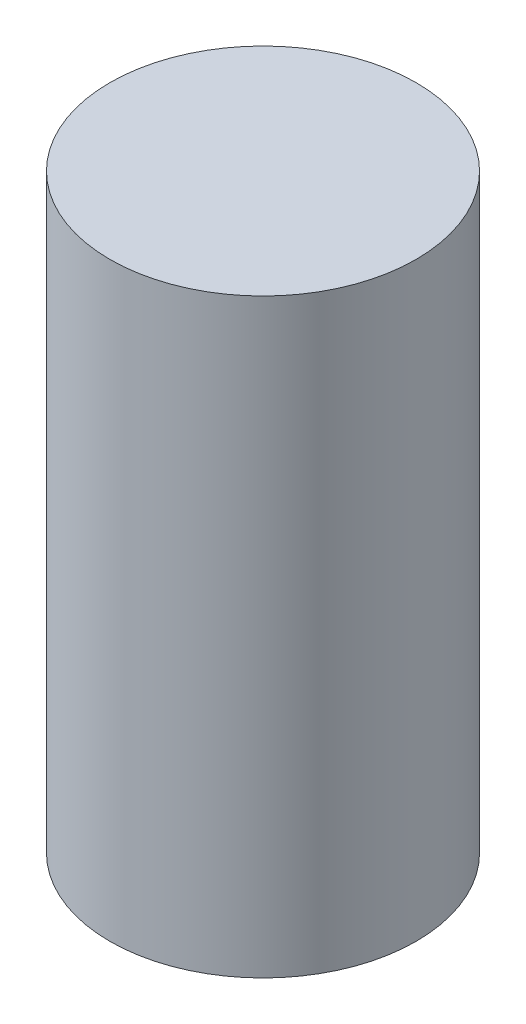
ISO-10303-21;
HEADER;
FILE_DESCRIPTION(('STEP AP214'),'2;1');
FILE_NAME('part.step','',(''),(''),'','','');
FILE_SCHEMA(('AUTOMOTIVE_DESIGN { 1 0 10303 214 1 1 1 1 }'));
ENDSEC;
DATA;
#1=APPLICATION_CONTEXT('core data for automotive mechanical design processes');
#2=APPLICATION_PROTOCOL_DEFINITION('international standard','automotive_design',2000,#1);
#3=PRODUCT_CONTEXT('',#1,'mechanical');
#4=PRODUCT('Part','Part','',(#3));
#5=PRODUCT_RELATED_PRODUCT_CATEGORY('part','',(#4));
#6=PRODUCT_DEFINITION_FORMATION('','',#4);
#7=PRODUCT_DEFINITION_CONTEXT('part definition',#1,'design');
#8=PRODUCT_DEFINITION('design','',#6,#7);
#9=PRODUCT_DEFINITION_SHAPE('','',#8);
#10=(LENGTH_UNIT() NAMED_UNIT(*) SI_UNIT(.MILLI.,.METRE.));
#11=(NAMED_UNIT(*) PLANE_ANGLE_UNIT() SI_UNIT($,.RADIAN.));
#12=(NAMED_UNIT(*) SI_UNIT($,.STERADIAN.) SOLID_ANGLE_UNIT());
#13=UNCERTAINTY_MEASURE_WITH_UNIT(LENGTH_MEASURE(1.E-05),#10,'distance_accuracy_value','');
#14=(GEOMETRIC_REPRESENTATION_CONTEXT(3) GLOBAL_UNCERTAINTY_ASSIGNED_CONTEXT((#13)) GLOBAL_UNIT_ASSIGNED_CONTEXT((#10,
#11,#12)) REPRESENTATION_CONTEXT('',''));
#15=CARTESIAN_POINT('',(0.,0.,0.));
#16=DIRECTION('',(0.,0.,1.));
#17=DIRECTION('',(1.,0.,0.));
#18=AXIS2_PLACEMENT_3D('',#15,#16,#17);
#19=CARTESIAN_POINT('',(0.,13.5,0.));
#20=DIRECTION('',(0.,-1.,0.));
#21=DIRECTION('',(0.,0.,-1.));
#22=AXIS2_PLACEMENT_3D('',#19,#20,#21);
#23=CYLINDRICAL_SURFACE('',#22,3.5);
#24=CARTESIAN_POINT('',(0.,13.5,0.));
#25=DIRECTION('',(0.,1.,0.));
#26=DIRECTION('',(0.,0.,1.));
#27=AXIS2_PLACEMENT_3D('',#24,#25,#26);
#28=CIRCLE('',#27,3.5);
#29=CARTESIAN_POINT('',(0.,13.5,3.5));
#30=VERTEX_POINT('',#29);
#31=EDGE_CURVE('E10',#30,#30,#28,.T.);
#32=ORIENTED_EDGE('',*,*,#31,.F.);
#33=EDGE_LOOP('',(#32));
#34=FACE_BOUND('',#33,.T.);
#35=CARTESIAN_POINT('',(0.,0.,0.));
#36=DIRECTION('',(0.,1.,0.));
#37=DIRECTION('',(0.,0.,1.));
#38=AXIS2_PLACEMENT_3D('',#35,#36,#37);
#39=CIRCLE('',#38,3.5);
#40=CARTESIAN_POINT('',(0.,0.,3.5));
#41=VERTEX_POINT('',#40);
#42=EDGE_CURVE('E46',#41,#41,#39,.T.);
#43=ORIENTED_EDGE('',*,*,#42,.T.);
#44=EDGE_LOOP('',(#43));
#45=FACE_BOUND('',#44,.T.);
#46=ADVANCED_FACE('F43',(#34,#45),#23,.T.);
#47=CARTESIAN_POINT('',(0.,13.5,0.));
#48=DIRECTION('',(0.,1.,0.));
#49=DIRECTION('',(0.,0.,1.));
#50=AXIS2_PLACEMENT_3D('',#47,#48,#49);
#51=PLANE('',#50);
#52=ORIENTED_EDGE('',*,*,#31,.T.);
#53=EDGE_LOOP('',(#52));
#54=FACE_BOUND('',#53,.T.);
#55=ADVANCED_FACE('F60',(#54),#51,.T.);
#56=CARTESIAN_POINT('',(0.,0.,0.));
#57=DIRECTION('',(0.,1.,0.));
#58=DIRECTION('',(0.,0.,1.));
#59=AXIS2_PLACEMENT_3D('',#56,#57,#58);
#60=PLANE('',#59);
#61=ORIENTED_EDGE('',*,*,#42,.F.);
#62=EDGE_LOOP('',(#61));
#63=FACE_BOUND('',#62,.T.);
#64=ADVANCED_FACE('F58',(#63),#60,.F.);
#65=CLOSED_SHELL('',(#46,#55,#64));
#66=MANIFOLD_SOLID_BREP('B2',#65);
#67=ADVANCED_BREP_SHAPE_REPRESENTATION('',(#18,#66),#14);
#68=SHAPE_DEFINITION_REPRESENTATION(#9,#67);
ENDSEC;
END-ISO-10303-21;
